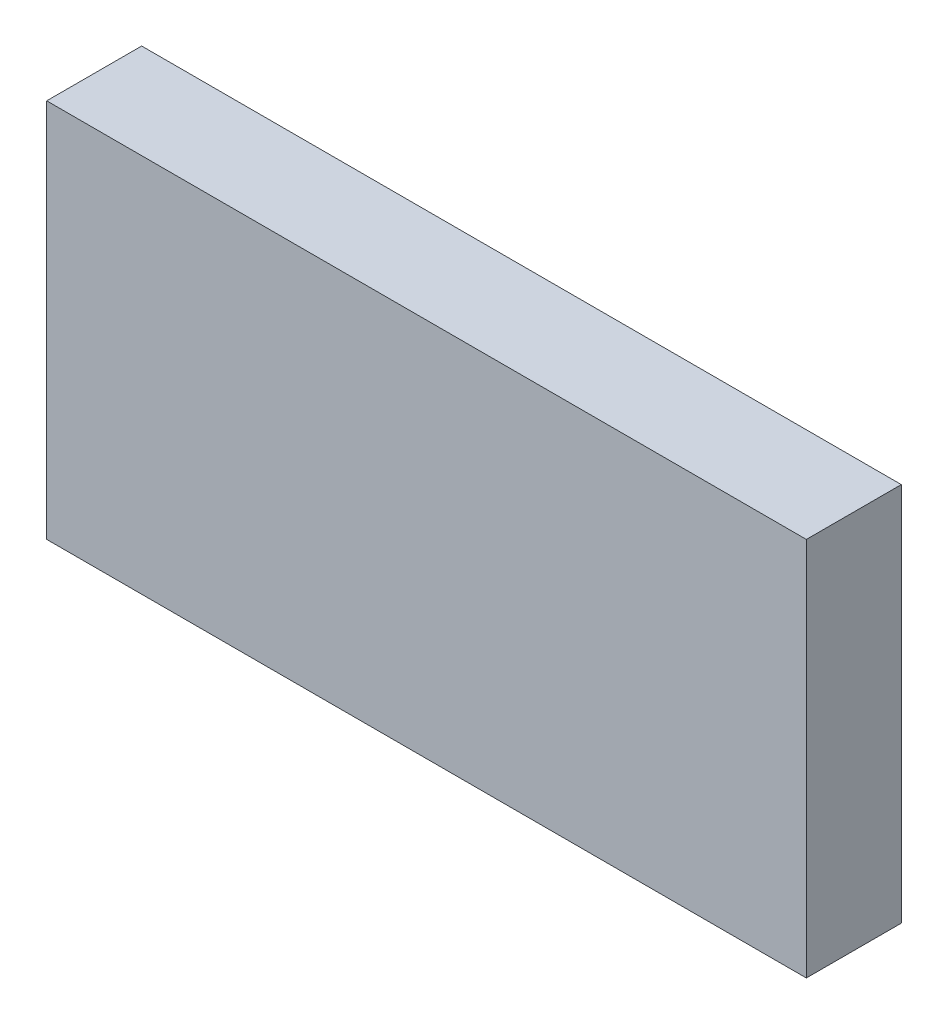
ISO-10303-21;
HEADER;
FILE_DESCRIPTION(('STEP AP214'),'2;1');
FILE_NAME('part.step','',(''),(''),'','','');
FILE_SCHEMA(('AUTOMOTIVE_DESIGN { 1 0 10303 214 1 1 1 1 }'));
ENDSEC;
DATA;
#1=APPLICATION_CONTEXT('core data for automotive mechanical design processes');
#2=APPLICATION_PROTOCOL_DEFINITION('international standard','automotive_design',2000,#1);
#3=PRODUCT_CONTEXT('',#1,'mechanical');
#4=PRODUCT('Part','Part','',(#3));
#5=PRODUCT_RELATED_PRODUCT_CATEGORY('part','',(#4));
#6=PRODUCT_DEFINITION_FORMATION('','',#4);
#7=PRODUCT_DEFINITION_CONTEXT('part definition',#1,'design');
#8=PRODUCT_DEFINITION('design','',#6,#7);
#9=PRODUCT_DEFINITION_SHAPE('','',#8);
#10=(LENGTH_UNIT() NAMED_UNIT(*) SI_UNIT(.MILLI.,.METRE.));
#11=(NAMED_UNIT(*) PLANE_ANGLE_UNIT() SI_UNIT($,.RADIAN.));
#12=(NAMED_UNIT(*) SI_UNIT($,.STERADIAN.) SOLID_ANGLE_UNIT());
#13=UNCERTAINTY_MEASURE_WITH_UNIT(LENGTH_MEASURE(1.E-05),#10,'distance_accuracy_value','');
#14=(GEOMETRIC_REPRESENTATION_CONTEXT(3) GLOBAL_UNCERTAINTY_ASSIGNED_CONTEXT((#13)) GLOBAL_UNIT_ASSIGNED_CONTEXT((#10,
#11,#12)) REPRESENTATION_CONTEXT('',''));
#15=CARTESIAN_POINT('',(0.,0.,0.));
#16=DIRECTION('',(0.,0.,1.));
#17=DIRECTION('',(1.,0.,0.));
#18=AXIS2_PLACEMENT_3D('',#15,#16,#17);
#19=CARTESIAN_POINT('',(50.5858711935384,-184.,3.));
#20=DIRECTION('',(1.,0.,0.));
#21=DIRECTION('',(0.,1.,0.));
#22=AXIS2_PLACEMENT_3D('',#19,#20,#21);
#23=PLANE('',#22);
#24=DIRECTION('',(0.,-1.,0.));
#25=VECTOR('',#24,1.);
#26=CARTESIAN_POINT('',(50.5858711935384,-184.,0.));
#27=LINE('',#26,#25);
#28=CARTESIAN_POINT('',(50.5858711935384,-184.,0.));
#29=VERTEX_POINT('',#28);
#30=CARTESIAN_POINT('',(50.5858711935384,-196.,0.));
#31=VERTEX_POINT('',#30);
#32=EDGE_CURVE('E98',#29,#31,#27,.T.);
#33=ORIENTED_EDGE('',*,*,#32,.T.);
#34=DIRECTION('',(0.,0.,-1.));
#35=VECTOR('',#34,1.);
#36=CARTESIAN_POINT('',(50.5858711935384,-196.,3.));
#37=LINE('',#36,#35);
#38=CARTESIAN_POINT('',(50.5858711935384,-196.,3.));
#39=VERTEX_POINT('',#38);
#40=EDGE_CURVE('E11',#39,#31,#37,.T.);
#41=ORIENTED_EDGE('',*,*,#40,.F.);
#42=DIRECTION('',(0.,-1.,0.));
#43=VECTOR('',#42,1.);
#44=CARTESIAN_POINT('',(50.5858711935384,-184.,3.));
#45=LINE('',#44,#43);
#46=CARTESIAN_POINT('',(50.5858711935384,-184.,3.));
#47=VERTEX_POINT('',#46);
#48=EDGE_CURVE('E86',#47,#39,#45,.T.);
#49=ORIENTED_EDGE('',*,*,#48,.F.);
#50=DIRECTION('',(0.,0.,-1.));
#51=VECTOR('',#50,1.);
#52=CARTESIAN_POINT('',(50.5858711935384,-184.,3.));
#53=LINE('',#52,#51);
#54=EDGE_CURVE('E94',#47,#29,#53,.T.);
#55=ORIENTED_EDGE('',*,*,#54,.T.);
#56=EDGE_LOOP('',(#33,#41,#49,#55));
#57=FACE_BOUND('',#56,.T.);
#58=ADVANCED_FACE('F35',(#57),#23,.F.);
#59=CARTESIAN_POINT('',(50.5858711935384,-196.,3.));
#60=DIRECTION('',(0.,1.,0.));
#61=DIRECTION('',(0.,0.,1.));
#62=AXIS2_PLACEMENT_3D('',#59,#60,#61);
#63=PLANE('',#62);
#64=DIRECTION('',(1.,0.,0.));
#65=VECTOR('',#64,1.);
#66=CARTESIAN_POINT('',(50.5858711935384,-196.,0.));
#67=LINE('',#66,#65);
#68=CARTESIAN_POINT('',(74.5858711935384,-196.,0.));
#69=VERTEX_POINT('',#68);
#70=EDGE_CURVE('E90',#31,#69,#67,.T.);
#71=ORIENTED_EDGE('',*,*,#70,.T.);
#72=DIRECTION('',(0.,0.,-1.));
#73=VECTOR('',#72,1.);
#74=CARTESIAN_POINT('',(74.5858711935384,-196.,3.));
#75=LINE('',#74,#73);
#76=CARTESIAN_POINT('',(74.5858711935384,-196.,3.));
#77=VERTEX_POINT('',#76);
#78=EDGE_CURVE('E43',#77,#69,#75,.T.);
#79=ORIENTED_EDGE('',*,*,#78,.F.);
#80=DIRECTION('',(1.,0.,0.));
#81=VECTOR('',#80,1.);
#82=CARTESIAN_POINT('',(50.5858711935384,-196.,3.));
#83=LINE('',#82,#81);
#84=EDGE_CURVE('E81',#39,#77,#83,.T.);
#85=ORIENTED_EDGE('',*,*,#84,.F.);
#86=ORIENTED_EDGE('',*,*,#40,.T.);
#87=EDGE_LOOP('',(#71,#79,#85,#86));
#88=FACE_BOUND('',#87,.T.);
#89=ADVANCED_FACE('F89',(#88),#63,.F.);
#90=CARTESIAN_POINT('',(74.5858711935384,-184.,3.));
#91=DIRECTION('',(-1.,0.,0.));
#92=DIRECTION('',(0.,-1.,0.));
#93=AXIS2_PLACEMENT_3D('',#90,#91,#92);
#94=PLANE('',#93);
#95=DIRECTION('',(0.,1.,0.));
#96=VECTOR('',#95,1.);
#97=CARTESIAN_POINT('',(74.5858711935384,-184.,0.));
#98=LINE('',#97,#96);
#99=CARTESIAN_POINT('',(74.5858711935384,-184.,0.));
#100=VERTEX_POINT('',#99);
#101=EDGE_CURVE('E68',#69,#100,#98,.T.);
#102=ORIENTED_EDGE('',*,*,#101,.T.);
#103=DIRECTION('',(0.,0.,-1.));
#104=VECTOR('',#103,1.);
#105=CARTESIAN_POINT('',(74.5858711935384,-184.,3.));
#106=LINE('',#105,#104);
#107=CARTESIAN_POINT('',(74.5858711935384,-184.,3.));
#108=VERTEX_POINT('',#107);
#109=EDGE_CURVE('E91',#108,#100,#106,.T.);
#110=ORIENTED_EDGE('',*,*,#109,.F.);
#111=DIRECTION('',(0.,1.,0.));
#112=VECTOR('',#111,1.);
#113=CARTESIAN_POINT('',(74.5858711935384,-184.,3.));
#114=LINE('',#113,#112);
#115=EDGE_CURVE('E84',#77,#108,#114,.T.);
#116=ORIENTED_EDGE('',*,*,#115,.F.);
#117=ORIENTED_EDGE('',*,*,#78,.T.);
#118=EDGE_LOOP('',(#102,#110,#116,#117));
#119=FACE_BOUND('',#118,.T.);
#120=ADVANCED_FACE('F92',(#119),#94,.F.);
#121=CARTESIAN_POINT('',(50.5858711935384,-184.,3.));
#122=DIRECTION('',(0.,-1.,0.));
#123=DIRECTION('',(0.,0.,-1.));
#124=AXIS2_PLACEMENT_3D('',#121,#122,#123);
#125=PLANE('',#124);
#126=DIRECTION('',(-1.,0.,0.));
#127=VECTOR('',#126,1.);
#128=CARTESIAN_POINT('',(50.5858711935384,-184.,0.));
#129=LINE('',#128,#127);
#130=EDGE_CURVE('E74',#100,#29,#129,.T.);
#131=ORIENTED_EDGE('',*,*,#130,.T.);
#132=ORIENTED_EDGE('',*,*,#54,.F.);
#133=DIRECTION('',(-1.,0.,0.));
#134=VECTOR('',#133,1.);
#135=CARTESIAN_POINT('',(50.5858711935384,-184.,3.));
#136=LINE('',#135,#134);
#137=EDGE_CURVE('E51',#108,#47,#136,.T.);
#138=ORIENTED_EDGE('',*,*,#137,.F.);
#139=ORIENTED_EDGE('',*,*,#109,.T.);
#140=EDGE_LOOP('',(#131,#132,#138,#139));
#141=FACE_BOUND('',#140,.T.);
#142=ADVANCED_FACE('F105',(#141),#125,.F.);
#143=CARTESIAN_POINT('',(0.,0.,3.));
#144=DIRECTION('',(0.,0.,1.));
#145=DIRECTION('',(1.,0.,0.));
#146=AXIS2_PLACEMENT_3D('',#143,#144,#145);
#147=PLANE('',#146);
#148=ORIENTED_EDGE('',*,*,#48,.T.);
#149=ORIENTED_EDGE('',*,*,#84,.T.);
#150=ORIENTED_EDGE('',*,*,#115,.T.);
#151=ORIENTED_EDGE('',*,*,#137,.T.);
#152=EDGE_LOOP('',(#148,#149,#150,#151));
#153=FACE_BOUND('',#152,.T.);
#154=ADVANCED_FACE('F82',(#153),#147,.T.);
#155=CARTESIAN_POINT('',(0.,0.,0.));
#156=DIRECTION('',(0.,0.,1.));
#157=DIRECTION('',(1.,0.,0.));
#158=AXIS2_PLACEMENT_3D('',#155,#156,#157);
#159=PLANE('',#158);
#160=ORIENTED_EDGE('',*,*,#32,.F.);
#161=ORIENTED_EDGE('',*,*,#130,.F.);
#162=ORIENTED_EDGE('',*,*,#101,.F.);
#163=ORIENTED_EDGE('',*,*,#70,.F.);
#164=EDGE_LOOP('',(#160,#161,#162,#163));
#165=FACE_BOUND('',#164,.T.);
#166=ADVANCED_FACE('F108',(#165),#159,.F.);
#167=CLOSED_SHELL('',(#58,#89,#120,#142,#154,#166));
#168=MANIFOLD_SOLID_BREP('B2',#167);
#169=ADVANCED_BREP_SHAPE_REPRESENTATION('',(#18,#168),#14);
#170=SHAPE_DEFINITION_REPRESENTATION(#9,#169);
ENDSEC;
END-ISO-10303-21;
